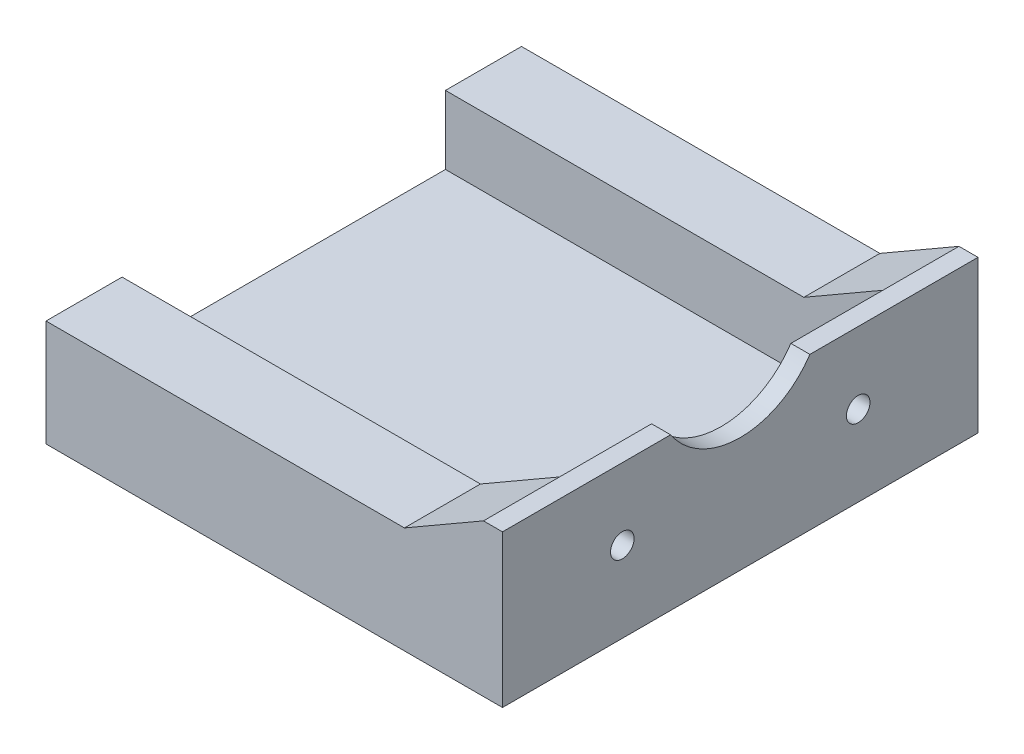
ISO-10303-21;
HEADER;
FILE_DESCRIPTION(('STEP AP214'),'2;1');
FILE_NAME('part.step','',(''),(''),'','','');
FILE_SCHEMA(('AUTOMOTIVE_DESIGN { 1 0 10303 214 1 1 1 1 }'));
ENDSEC;
DATA;
#1=APPLICATION_CONTEXT('core data for automotive mechanical design processes');
#2=APPLICATION_PROTOCOL_DEFINITION('international standard','automotive_design',2000,#1);
#3=PRODUCT_CONTEXT('',#1,'mechanical');
#4=PRODUCT('Part','Part','',(#3));
#5=PRODUCT_RELATED_PRODUCT_CATEGORY('part','',(#4));
#6=PRODUCT_DEFINITION_FORMATION('','',#4);
#7=PRODUCT_DEFINITION_CONTEXT('part definition',#1,'design');
#8=PRODUCT_DEFINITION('design','',#6,#7);
#9=PRODUCT_DEFINITION_SHAPE('','',#8);
#10=(LENGTH_UNIT() NAMED_UNIT(*) SI_UNIT(.MILLI.,.METRE.));
#11=(NAMED_UNIT(*) PLANE_ANGLE_UNIT() SI_UNIT($,.RADIAN.));
#12=(NAMED_UNIT(*) SI_UNIT($,.STERADIAN.) SOLID_ANGLE_UNIT());
#13=UNCERTAINTY_MEASURE_WITH_UNIT(LENGTH_MEASURE(1.E-05),#10,'distance_accuracy_value','');
#14=(GEOMETRIC_REPRESENTATION_CONTEXT(3) GLOBAL_UNCERTAINTY_ASSIGNED_CONTEXT((#13)) GLOBAL_UNIT_ASSIGNED_CONTEXT((#10,
#11,#12)) REPRESENTATION_CONTEXT('',''));
#15=CARTESIAN_POINT('',(0.,0.,0.));
#16=DIRECTION('',(0.,0.,1.));
#17=DIRECTION('',(1.,0.,0.));
#18=AXIS2_PLACEMENT_3D('',#15,#16,#17);
#19=CARTESIAN_POINT('',(10.,0.,-57.5));
#20=DIRECTION('',(0.,-1.,0.));
#21=DIRECTION('',(0.,0.,-1.));
#22=AXIS2_PLACEMENT_3D('',#19,#20,#21);
#23=CYLINDRICAL_SURFACE('',#22,3.2);
#24=CARTESIAN_POINT('',(10.,0.,-57.5));
#25=DIRECTION('',(0.,-1.,0.));
#26=DIRECTION('',(0.,0.,-1.));
#27=AXIS2_PLACEMENT_3D('',#24,#25,#26);
#28=CIRCLE('',#27,3.2);
#29=CARTESIAN_POINT('',(10.,0.,-60.7));
#30=VERTEX_POINT('',#29);
#31=EDGE_CURVE('E565',#30,#30,#28,.T.);
#32=ORIENTED_EDGE('',*,*,#31,.T.);
#33=EDGE_LOOP('',(#32));
#34=FACE_BOUND('',#33,.T.);
#35=CARTESIAN_POINT('',(10.,11.5,-57.5));
#36=DIRECTION('',(0.,1.,0.));
#37=DIRECTION('',(0.,0.,1.));
#38=AXIS2_PLACEMENT_3D('',#35,#36,#37);
#39=CIRCLE('',#38,3.2);
#40=CARTESIAN_POINT('',(10.,11.5,-54.3));
#41=VERTEX_POINT('',#40);
#42=EDGE_CURVE('E11',#41,#41,#39,.F.);
#43=ORIENTED_EDGE('',*,*,#42,.F.);
#44=EDGE_LOOP('',(#43));
#45=FACE_BOUND('',#44,.T.);
#46=ADVANCED_FACE('F36',(#34,#45),#23,.F.);
#47=CARTESIAN_POINT('',(40.,0.,-57.5));
#48=DIRECTION('',(0.,-1.,0.));
#49=DIRECTION('',(0.,0.,-1.));
#50=AXIS2_PLACEMENT_3D('',#47,#48,#49);
#51=CYLINDRICAL_SURFACE('',#50,3.19999999999999);
#52=CARTESIAN_POINT('',(40.,0.,-57.5));
#53=DIRECTION('',(0.,-1.,0.));
#54=DIRECTION('',(0.,0.,-1.));
#55=AXIS2_PLACEMENT_3D('',#52,#53,#54);
#56=CIRCLE('',#55,3.19999999999999);
#57=CARTESIAN_POINT('',(40.,0.,-60.7));
#58=VERTEX_POINT('',#57);
#59=EDGE_CURVE('E563',#58,#58,#56,.T.);
#60=ORIENTED_EDGE('',*,*,#59,.T.);
#61=EDGE_LOOP('',(#60));
#62=FACE_BOUND('',#61,.T.);
#63=CARTESIAN_POINT('',(40.,11.5,-57.5));
#64=DIRECTION('',(0.,1.,0.));
#65=DIRECTION('',(0.,0.,1.));
#66=AXIS2_PLACEMENT_3D('',#63,#64,#65);
#67=CIRCLE('',#66,3.19999999999999);
#68=CARTESIAN_POINT('',(40.,11.5,-54.3));
#69=VERTEX_POINT('',#68);
#70=EDGE_CURVE('E45',#69,#69,#67,.F.);
#71=ORIENTED_EDGE('',*,*,#70,.F.);
#72=EDGE_LOOP('',(#71));
#73=FACE_BOUND('',#72,.T.);
#74=ADVANCED_FACE('F249',(#62,#73),#51,.F.);
#75=CARTESIAN_POINT('',(0.,5.,0.));
#76=DIRECTION('',(0.,-1.,0.));
#77=DIRECTION('',(0.,0.,-1.));
#78=AXIS2_PLACEMENT_3D('',#75,#76,#77);
#79=PLANE('',#78);
#80=DIRECTION('',(1.,0.,0.));
#81=VECTOR('',#80,1.);
#82=CARTESIAN_POINT('',(31.5192378864665,5.,-52.5));
#83=LINE('',#82,#81);
#84=CARTESIAN_POINT('',(0.,5.,-52.5));
#85=VERTEX_POINT('',#84);
#86=CARTESIAN_POINT('',(57.5,5.,-52.5));
#87=VERTEX_POINT('',#86);
#88=EDGE_CURVE('E160',#85,#87,#83,.T.);
#89=ORIENTED_EDGE('',*,*,#88,.F.);
#90=DIRECTION('',(0.,0.,1.));
#91=VECTOR('',#90,1.);
#92=CARTESIAN_POINT('',(0.,5.,0.));
#93=LINE('',#92,#91);
#94=CARTESIAN_POINT('',(0.,5.,-10.));
#95=VERTEX_POINT('',#94);
#96=EDGE_CURVE('E151',#85,#95,#93,.T.);
#97=ORIENTED_EDGE('',*,*,#96,.T.);
#98=DIRECTION('',(1.,0.,0.));
#99=VECTOR('',#98,1.);
#100=CARTESIAN_POINT('',(31.5192378864665,5.,-10.));
#101=LINE('',#100,#99);
#102=CARTESIAN_POINT('',(57.5,5.,-10.));
#103=VERTEX_POINT('',#102);
#104=EDGE_CURVE('E186',#95,#103,#101,.T.);
#105=ORIENTED_EDGE('',*,*,#104,.T.);
#106=DIRECTION('',(0.,0.,1.));
#107=VECTOR('',#106,1.);
#108=CARTESIAN_POINT('',(57.5,5.,0.));
#109=LINE('',#108,#107);
#110=EDGE_CURVE('E200',#87,#103,#109,.T.);
#111=ORIENTED_EDGE('',*,*,#110,.F.);
#112=EDGE_LOOP('',(#89,#97,#105,#111));
#113=FACE_BOUND('',#112,.T.);
#114=ADVANCED_FACE('F251',(#113),#79,.F.);
#115=CARTESIAN_POINT('',(57.5,20.,-52.5));
#116=DIRECTION('',(0.499999999999995,-0.866025403784442,0.));
#117=DIRECTION('',(0.866025403784442,0.499999999999995,0.));
#118=AXIS2_PLACEMENT_3D('',#115,#116,#117);
#119=PLANE('',#118);
#120=DIRECTION('',(0.,0.,-1.));
#121=VECTOR('',#120,1.);
#122=CARTESIAN_POINT('',(47.1076951545867,14.,-52.5));
#123=LINE('',#122,#121);
#124=CARTESIAN_POINT('',(47.1076951545866,14.,-52.5));
#125=VERTEX_POINT('',#124);
#126=CARTESIAN_POINT('',(47.1076951545867,14.0000000000001,-62.5));
#127=VERTEX_POINT('',#126);
#128=EDGE_CURVE('E146',#125,#127,#123,.T.);
#129=ORIENTED_EDGE('',*,*,#128,.F.);
#130=DIRECTION('',(-0.866025403784442,-0.499999999999995,0.));
#131=VECTOR('',#130,1.);
#132=CARTESIAN_POINT('',(57.5,20.,-52.5));
#133=LINE('',#132,#131);
#134=CARTESIAN_POINT('',(57.5,20.,-52.5));
#135=VERTEX_POINT('',#134);
#136=EDGE_CURVE('E136',#135,#125,#133,.T.);
#137=ORIENTED_EDGE('',*,*,#136,.F.);
#138=DIRECTION('',(0.,0.,-1.));
#139=VECTOR('',#138,1.);
#140=CARTESIAN_POINT('',(57.5,20.,-52.5));
#141=LINE('',#140,#139);
#142=CARTESIAN_POINT('',(57.5,20.,-62.5));
#143=VERTEX_POINT('',#142);
#144=EDGE_CURVE('E163',#135,#143,#141,.T.);
#145=ORIENTED_EDGE('',*,*,#144,.T.);
#146=DIRECTION('',(-0.866025403784442,-0.499999999999995,0.));
#147=VECTOR('',#146,1.);
#148=CARTESIAN_POINT('',(57.5,20.,-62.5));
#149=LINE('',#148,#147);
#150=EDGE_CURVE('E61',#143,#127,#149,.T.);
#151=ORIENTED_EDGE('',*,*,#150,.T.);
#152=EDGE_LOOP('',(#129,#137,#145,#151));
#153=FACE_BOUND('',#152,.T.);
#154=ADVANCED_FACE('F258',(#153),#119,.F.);
#155=CARTESIAN_POINT('',(57.5,20.,-10.));
#156=DIRECTION('',(-0.499999999999995,0.866025403784442,0.));
#157=DIRECTION('',(-0.866025403784442,-0.499999999999995,0.));
#158=AXIS2_PLACEMENT_3D('',#155,#156,#157);
#159=PLANE('',#158);
#160=DIRECTION('',(-0.866025403784442,-0.499999999999995,0.));
#161=VECTOR('',#160,1.);
#162=CARTESIAN_POINT('',(57.5,20.,-10.));
#163=LINE('',#162,#161);
#164=CARTESIAN_POINT('',(57.5,20.,-10.));
#165=VERTEX_POINT('',#164);
#166=CARTESIAN_POINT('',(47.1076951545867,14.,-10.));
#167=VERTEX_POINT('',#166);
#168=EDGE_CURVE('E183',#165,#167,#163,.T.);
#169=ORIENTED_EDGE('',*,*,#168,.T.);
#170=DIRECTION('',(0.,0.,1.));
#171=VECTOR('',#170,1.);
#172=CARTESIAN_POINT('',(47.1076951545867,14.,-10.));
#173=LINE('',#172,#171);
#174=CARTESIAN_POINT('',(47.1076951545867,14.,0.));
#175=VERTEX_POINT('',#174);
#176=EDGE_CURVE('E172',#167,#175,#173,.T.);
#177=ORIENTED_EDGE('',*,*,#176,.T.);
#178=DIRECTION('',(-0.866025403784442,-0.499999999999995,0.));
#179=VECTOR('',#178,1.);
#180=CARTESIAN_POINT('',(57.5,20.,0.));
#181=LINE('',#180,#179);
#182=CARTESIAN_POINT('',(57.5,20.,0.));
#183=VERTEX_POINT('',#182);
#184=EDGE_CURVE('E180',#183,#175,#181,.T.);
#185=ORIENTED_EDGE('',*,*,#184,.F.);
#186=DIRECTION('',(0.,0.,-1.));
#187=VECTOR('',#186,1.);
#188=CARTESIAN_POINT('',(57.5,20.,0.));
#189=LINE('',#188,#187);
#190=EDGE_CURVE('E197',#183,#165,#189,.T.);
#191=ORIENTED_EDGE('',*,*,#190,.T.);
#192=EDGE_LOOP('',(#169,#177,#185,#191));
#193=FACE_BOUND('',#192,.T.);
#194=ADVANCED_FACE('F291',(#193),#159,.T.);
#195=CARTESIAN_POINT('',(0.,5.,0.));
#196=DIRECTION('',(1.,0.,0.));
#197=DIRECTION('',(0.,0.,-1.));
#198=AXIS2_PLACEMENT_3D('',#195,#196,#197);
#199=PLANE('',#198);
#200=DIRECTION('',(0.,0.,1.));
#201=VECTOR('',#200,1.);
#202=CARTESIAN_POINT('',(0.,0.,0.));
#203=LINE('',#202,#201);
#204=CARTESIAN_POINT('',(0.,0.,-62.5));
#205=VERTEX_POINT('',#204);
#206=CARTESIAN_POINT('',(0.,0.,0.));
#207=VERTEX_POINT('',#206);
#208=EDGE_CURVE('E210',#205,#207,#203,.T.);
#209=ORIENTED_EDGE('',*,*,#208,.T.);
#210=DIRECTION('',(0.,-1.,0.));
#211=VECTOR('',#210,1.);
#212=CARTESIAN_POINT('',(0.,5.,0.));
#213=LINE('',#212,#211);
#214=CARTESIAN_POINT('',(0.,14.,0.));
#215=VERTEX_POINT('',#214);
#216=EDGE_CURVE('E237',#215,#207,#213,.T.);
#217=ORIENTED_EDGE('',*,*,#216,.F.);
#218=DIRECTION('',(0.,0.,1.));
#219=VECTOR('',#218,1.);
#220=CARTESIAN_POINT('',(0.,14.,-10.));
#221=LINE('',#220,#219);
#222=CARTESIAN_POINT('',(0.,14.,-10.));
#223=VERTEX_POINT('',#222);
#224=EDGE_CURVE('E177',#223,#215,#221,.T.);
#225=ORIENTED_EDGE('',*,*,#224,.F.);
#226=DIRECTION('',(0.,-1.,0.));
#227=VECTOR('',#226,1.);
#228=CARTESIAN_POINT('',(0.,14.,-10.));
#229=LINE('',#228,#227);
#230=EDGE_CURVE('E167',#223,#95,#229,.T.);
#231=ORIENTED_EDGE('',*,*,#230,.T.);
#232=ORIENTED_EDGE('',*,*,#96,.F.);
#233=DIRECTION('',(0.,-1.,0.));
#234=VECTOR('',#233,1.);
#235=CARTESIAN_POINT('',(0.,14.,-52.5));
#236=LINE('',#235,#234);
#237=CARTESIAN_POINT('',(0.,14.,-52.5));
#238=VERTEX_POINT('',#237);
#239=EDGE_CURVE('E53',#238,#85,#236,.T.);
#240=ORIENTED_EDGE('',*,*,#239,.F.);
#241=DIRECTION('',(0.,0.,-1.));
#242=VECTOR('',#241,1.);
#243=CARTESIAN_POINT('',(0.,14.,-52.5));
#244=LINE('',#243,#242);
#245=CARTESIAN_POINT('',(0.,14.,-62.5));
#246=VERTEX_POINT('',#245);
#247=EDGE_CURVE('E142',#238,#246,#244,.T.);
#248=ORIENTED_EDGE('',*,*,#247,.T.);
#249=DIRECTION('',(0.,-1.,0.));
#250=VECTOR('',#249,1.);
#251=CARTESIAN_POINT('',(0.,5.,-62.5));
#252=LINE('',#251,#250);
#253=EDGE_CURVE('E221',#246,#205,#252,.T.);
#254=ORIENTED_EDGE('',*,*,#253,.T.);
#255=EDGE_LOOP('',(#209,#217,#225,#231,#232,#240,#248,#254));
#256=FACE_BOUND('',#255,.T.);
#257=ADVANCED_FACE('F38',(#256),#199,.F.);
#258=CARTESIAN_POINT('',(0.,5.,0.));
#259=DIRECTION('',(0.,0.,-1.));
#260=DIRECTION('',(-1.,0.,0.));
#261=AXIS2_PLACEMENT_3D('',#258,#259,#260);
#262=PLANE('',#261);
#263=ORIENTED_EDGE('',*,*,#184,.T.);
#264=DIRECTION('',(-1.,0.,0.));
#265=VECTOR('',#264,1.);
#266=CARTESIAN_POINT('',(47.1076951545867,14.,0.));
#267=LINE('',#266,#265);
#268=EDGE_CURVE('E166',#175,#215,#267,.T.);
#269=ORIENTED_EDGE('',*,*,#268,.T.);
#270=ORIENTED_EDGE('',*,*,#216,.T.);
#271=DIRECTION('',(1.,0.,0.));
#272=VECTOR('',#271,1.);
#273=CARTESIAN_POINT('',(0.,0.,0.));
#274=LINE('',#273,#272);
#275=CARTESIAN_POINT('',(60.,0.,0.));
#276=VERTEX_POINT('',#275);
#277=EDGE_CURVE('E224',#207,#276,#274,.T.);
#278=ORIENTED_EDGE('',*,*,#277,.T.);
#279=DIRECTION('',(0.,-1.,0.));
#280=VECTOR('',#279,1.);
#281=CARTESIAN_POINT('',(60.,5.,0.));
#282=LINE('',#281,#280);
#283=CARTESIAN_POINT('',(60.,20.,0.));
#284=VERTEX_POINT('',#283);
#285=EDGE_CURVE('E234',#284,#276,#282,.T.);
#286=ORIENTED_EDGE('',*,*,#285,.F.);
#287=DIRECTION('',(1.,0.,0.));
#288=VECTOR('',#287,1.);
#289=CARTESIAN_POINT('',(57.5,20.,0.));
#290=LINE('',#289,#288);
#291=EDGE_CURVE('E214',#183,#284,#290,.T.);
#292=ORIENTED_EDGE('',*,*,#291,.F.);
#293=EDGE_LOOP('',(#263,#269,#270,#278,#286,#292));
#294=FACE_BOUND('',#293,.T.);
#295=ADVANCED_FACE('F325',(#294),#262,.F.);
#296=CARTESIAN_POINT('',(60.,5.,0.));
#297=DIRECTION('',(-1.,0.,0.));
#298=DIRECTION('',(0.,0.,1.));
#299=AXIS2_PLACEMENT_3D('',#296,#297,#298);
#300=PLANE('',#299);
#301=CARTESIAN_POINT('',(60.,10.6000000000001,-15.7499999999999));
#302=DIRECTION('',(1.,0.,0.));
#303=DIRECTION('',(0.,0.,-1.));
#304=AXIS2_PLACEMENT_3D('',#301,#302,#303);
#305=CIRCLE('',#304,1.55);
#306=CARTESIAN_POINT('',(60.,10.6000000000001,-17.2999999999999));
#307=VERTEX_POINT('',#306);
#308=EDGE_CURVE('E242',#307,#307,#305,.T.);
#309=ORIENTED_EDGE('',*,*,#308,.F.);
#310=EDGE_LOOP('',(#309));
#311=FACE_BOUND('',#310,.T.);
#312=CARTESIAN_POINT('',(60.,10.5999999999999,-46.75));
#313=DIRECTION('',(1.,0.,0.));
#314=DIRECTION('',(0.,0.,-1.));
#315=AXIS2_PLACEMENT_3D('',#312,#313,#314);
#316=CIRCLE('',#315,1.55);
#317=CARTESIAN_POINT('',(60.,10.5999999999999,-48.3));
#318=VERTEX_POINT('',#317);
#319=EDGE_CURVE('E577',#318,#318,#316,.T.);
#320=ORIENTED_EDGE('',*,*,#319,.F.);
#321=EDGE_LOOP('',(#320));
#322=FACE_BOUND('',#321,.T.);
#323=DIRECTION('',(0.,0.,-1.));
#324=VECTOR('',#323,1.);
#325=CARTESIAN_POINT('',(60.,0.,0.));
#326=LINE('',#325,#324);
#327=CARTESIAN_POINT('',(60.,0.,-62.5));
#328=VERTEX_POINT('',#327);
#329=EDGE_CURVE('E226',#276,#328,#326,.T.);
#330=ORIENTED_EDGE('',*,*,#329,.T.);
#331=DIRECTION('',(0.,-1.,0.));
#332=VECTOR('',#331,1.);
#333=CARTESIAN_POINT('',(60.,5.,-62.5));
#334=LINE('',#333,#332);
#335=CARTESIAN_POINT('',(60.,20.,-62.5));
#336=VERTEX_POINT('',#335);
#337=EDGE_CURVE('E231',#336,#328,#334,.T.);
#338=ORIENTED_EDGE('',*,*,#337,.F.);
#339=DIRECTION('',(0.,0.,-1.));
#340=VECTOR('',#339,1.);
#341=CARTESIAN_POINT('',(60.,20.,0.));
#342=LINE('',#341,#340);
#343=CARTESIAN_POINT('',(60.,20.,-40.4036877814354));
#344=VERTEX_POINT('',#343);
#345=EDGE_CURVE('E196',#344,#336,#342,.T.);
#346=ORIENTED_EDGE('',*,*,#345,.F.);
#347=CARTESIAN_POINT('',(60.,26.1,-31.25));
#348=DIRECTION('',(1.,0.,0.));
#349=DIRECTION('',(0.,0.,-1.));
#350=AXIS2_PLACEMENT_3D('',#347,#348,#349);
#351=CIRCLE('',#350,11.);
#352=CARTESIAN_POINT('',(60.,20.,-22.0963122185646));
#353=VERTEX_POINT('',#352);
#354=EDGE_CURVE('E189',#353,#344,#351,.T.);
#355=ORIENTED_EDGE('',*,*,#354,.F.);
#356=EDGE_CURVE('E205',#284,#353,#342,.T.);
#357=ORIENTED_EDGE('',*,*,#356,.F.);
#358=ORIENTED_EDGE('',*,*,#285,.T.);
#359=EDGE_LOOP('',(#330,#338,#346,#355,#357,#358));
#360=FACE_BOUND('',#359,.T.);
#361=ADVANCED_FACE('F322',(#311,#322,#360),#300,.F.);
#362=CARTESIAN_POINT('',(0.,5.,-62.5));
#363=DIRECTION('',(0.,0.,1.));
#364=DIRECTION('',(1.,0.,0.));
#365=AXIS2_PLACEMENT_3D('',#362,#363,#364);
#366=PLANE('',#365);
#367=DIRECTION('',(-1.,0.,0.));
#368=VECTOR('',#367,1.);
#369=CARTESIAN_POINT('',(47.1076951545867,14.,-62.5));
#370=LINE('',#369,#368);
#371=EDGE_CURVE('E138',#127,#246,#370,.T.);
#372=ORIENTED_EDGE('',*,*,#371,.F.);
#373=ORIENTED_EDGE('',*,*,#150,.F.);
#374=DIRECTION('',(1.,0.,0.));
#375=VECTOR('',#374,1.);
#376=CARTESIAN_POINT('',(57.5,20.,-62.5));
#377=LINE('',#376,#375);
#378=EDGE_CURVE('E211',#143,#336,#377,.T.);
#379=ORIENTED_EDGE('',*,*,#378,.T.);
#380=ORIENTED_EDGE('',*,*,#337,.T.);
#381=DIRECTION('',(-1.,0.,0.));
#382=VECTOR('',#381,1.);
#383=CARTESIAN_POINT('',(0.,0.,-62.5));
#384=LINE('',#383,#382);
#385=EDGE_CURVE('E222',#328,#205,#384,.T.);
#386=ORIENTED_EDGE('',*,*,#385,.T.);
#387=ORIENTED_EDGE('',*,*,#253,.F.);
#388=EDGE_LOOP('',(#372,#373,#379,#380,#386,#387));
#389=FACE_BOUND('',#388,.T.);
#390=ADVANCED_FACE('F318',(#389),#366,.F.);
#391=CARTESIAN_POINT('',(0.,0.,0.));
#392=DIRECTION('',(0.,-1.,0.));
#393=DIRECTION('',(0.,0.,-1.));
#394=AXIS2_PLACEMENT_3D('',#391,#392,#393);
#395=PLANE('',#394);
#396=ORIENTED_EDGE('',*,*,#59,.F.);
#397=EDGE_LOOP('',(#396));
#398=FACE_BOUND('',#397,.T.);
#399=ORIENTED_EDGE('',*,*,#31,.F.);
#400=EDGE_LOOP('',(#399));
#401=FACE_BOUND('',#400,.T.);
#402=CARTESIAN_POINT('',(40.,0.,-5.));
#403=DIRECTION('',(0.,-1.,0.));
#404=DIRECTION('',(0.,0.,-1.));
#405=AXIS2_PLACEMENT_3D('',#402,#403,#404);
#406=CIRCLE('',#405,3.19999999999999);
#407=CARTESIAN_POINT('',(40.,0.,-8.2));
#408=VERTEX_POINT('',#407);
#409=EDGE_CURVE('E571',#408,#408,#406,.T.);
#410=ORIENTED_EDGE('',*,*,#409,.F.);
#411=EDGE_LOOP('',(#410));
#412=FACE_BOUND('',#411,.T.);
#413=CARTESIAN_POINT('',(10.,0.,-5.));
#414=DIRECTION('',(0.,-1.,0.));
#415=DIRECTION('',(0.,0.,-1.));
#416=AXIS2_PLACEMENT_3D('',#413,#414,#415);
#417=CIRCLE('',#416,3.2);
#418=CARTESIAN_POINT('',(10.,0.,-8.2));
#419=VERTEX_POINT('',#418);
#420=EDGE_CURVE('E574',#419,#419,#417,.T.);
#421=ORIENTED_EDGE('',*,*,#420,.F.);
#422=EDGE_LOOP('',(#421));
#423=FACE_BOUND('',#422,.T.);
#424=ORIENTED_EDGE('',*,*,#208,.F.);
#425=ORIENTED_EDGE('',*,*,#385,.F.);
#426=ORIENTED_EDGE('',*,*,#329,.F.);
#427=ORIENTED_EDGE('',*,*,#277,.F.);
#428=EDGE_LOOP('',(#424,#425,#426,#427));
#429=FACE_BOUND('',#428,.T.);
#430=ADVANCED_FACE('F313',(#398,#401,#412,#423,#429),#395,.T.);
#431=CARTESIAN_POINT('',(57.5,26.1,-31.25));
#432=DIRECTION('',(1.,0.,0.));
#433=DIRECTION('',(0.,0.,-1.));
#434=AXIS2_PLACEMENT_3D('',#431,#432,#433);
#435=CYLINDRICAL_SURFACE('',#434,11.);
#436=ORIENTED_EDGE('',*,*,#354,.T.);
#437=DIRECTION('',(1.,0.,0.));
#438=VECTOR('',#437,1.);
#439=CARTESIAN_POINT('',(57.5,20.,-40.4036877814354));
#440=LINE('',#439,#438);
#441=CARTESIAN_POINT('',(57.5,20.,-40.4036877814354));
#442=VERTEX_POINT('',#441);
#443=EDGE_CURVE('E207',#442,#344,#440,.T.);
#444=ORIENTED_EDGE('',*,*,#443,.F.);
#445=CARTESIAN_POINT('',(57.5,26.1,-31.25));
#446=DIRECTION('',(1.,0.,0.));
#447=DIRECTION('',(0.,0.,-1.));
#448=AXIS2_PLACEMENT_3D('',#445,#446,#447);
#449=CIRCLE('',#448,11.);
#450=CARTESIAN_POINT('',(57.5,20.,-22.0963122185646));
#451=VERTEX_POINT('',#450);
#452=EDGE_CURVE('E192',#451,#442,#449,.T.);
#453=ORIENTED_EDGE('',*,*,#452,.F.);
#454=DIRECTION('',(1.,0.,0.));
#455=VECTOR('',#454,1.);
#456=CARTESIAN_POINT('',(57.5,20.,-22.0963122185646));
#457=LINE('',#456,#455);
#458=EDGE_CURVE('E217',#451,#353,#457,.T.);
#459=ORIENTED_EDGE('',*,*,#458,.T.);
#460=EDGE_LOOP('',(#436,#444,#453,#459));
#461=FACE_BOUND('',#460,.T.);
#462=ADVANCED_FACE('F310',(#461),#435,.F.);
#463=CARTESIAN_POINT('',(57.5,20.,0.));
#464=DIRECTION('',(0.,-1.,0.));
#465=DIRECTION('',(0.,0.,-1.));
#466=AXIS2_PLACEMENT_3D('',#463,#464,#465);
#467=PLANE('',#466);
#468=ORIENTED_EDGE('',*,*,#345,.T.);
#469=ORIENTED_EDGE('',*,*,#378,.F.);
#470=ORIENTED_EDGE('',*,*,#144,.F.);
#471=EDGE_CURVE('E201',#442,#135,#189,.T.);
#472=ORIENTED_EDGE('',*,*,#471,.F.);
#473=ORIENTED_EDGE('',*,*,#443,.T.);
#474=EDGE_LOOP('',(#468,#469,#470,#472,#473));
#475=FACE_BOUND('',#474,.T.);
#476=ADVANCED_FACE('F307',(#475),#467,.F.);
#477=ORIENTED_EDGE('',*,*,#356,.T.);
#478=ORIENTED_EDGE('',*,*,#458,.F.);
#479=EDGE_CURVE('E195',#165,#451,#189,.T.);
#480=ORIENTED_EDGE('',*,*,#479,.F.);
#481=ORIENTED_EDGE('',*,*,#190,.F.);
#482=ORIENTED_EDGE('',*,*,#291,.T.);
#483=EDGE_LOOP('',(#477,#478,#480,#481,#482));
#484=FACE_BOUND('',#483,.T.);
#485=ADVANCED_FACE('F305',(#484),#467,.F.);
#486=CARTESIAN_POINT('',(57.5,0.,0.));
#487=DIRECTION('',(1.,0.,0.));
#488=DIRECTION('',(0.,0.,-1.));
#489=AXIS2_PLACEMENT_3D('',#486,#487,#488);
#490=PLANE('',#489);
#491=CARTESIAN_POINT('',(57.5,10.6000000000001,-15.7499999999999));
#492=DIRECTION('',(1.,0.,0.));
#493=DIRECTION('',(0.,0.,-1.));
#494=AXIS2_PLACEMENT_3D('',#491,#492,#493);
#495=CIRCLE('',#494,1.55);
#496=CARTESIAN_POINT('',(57.5,10.6000000000001,-17.2999999999999));
#497=VERTEX_POINT('',#496);
#498=EDGE_CURVE('E155',#497,#497,#495,.T.);
#499=ORIENTED_EDGE('',*,*,#498,.T.);
#500=EDGE_LOOP('',(#499));
#501=FACE_BOUND('',#500,.T.);
#502=CARTESIAN_POINT('',(57.5,10.5999999999999,-46.75));
#503=DIRECTION('',(1.,0.,0.));
#504=DIRECTION('',(0.,0.,-1.));
#505=AXIS2_PLACEMENT_3D('',#502,#503,#504);
#506=CIRCLE('',#505,1.55);
#507=CARTESIAN_POINT('',(57.5,10.5999999999999,-48.3));
#508=VERTEX_POINT('',#507);
#509=EDGE_CURVE('E239',#508,#508,#506,.T.);
#510=ORIENTED_EDGE('',*,*,#509,.T.);
#511=EDGE_LOOP('',(#510));
#512=FACE_BOUND('',#511,.T.);
#513=ORIENTED_EDGE('',*,*,#471,.T.);
#514=DIRECTION('',(0.,1.,0.));
#515=VECTOR('',#514,1.);
#516=CARTESIAN_POINT('',(57.5,5.,-52.5));
#517=LINE('',#516,#515);
#518=EDGE_CURVE('E158',#87,#135,#517,.T.);
#519=ORIENTED_EDGE('',*,*,#518,.F.);
#520=ORIENTED_EDGE('',*,*,#110,.T.);
#521=DIRECTION('',(0.,1.,0.));
#522=VECTOR('',#521,1.);
#523=CARTESIAN_POINT('',(57.5,5.,-10.));
#524=LINE('',#523,#522);
#525=EDGE_CURVE('E181',#103,#165,#524,.T.);
#526=ORIENTED_EDGE('',*,*,#525,.T.);
#527=ORIENTED_EDGE('',*,*,#479,.T.);
#528=ORIENTED_EDGE('',*,*,#452,.T.);
#529=EDGE_LOOP('',(#513,#519,#520,#526,#527,#528));
#530=FACE_BOUND('',#529,.T.);
#531=ADVANCED_FACE('F298',(#501,#512,#530),#490,.F.);
#532=CARTESIAN_POINT('',(0.,0.,-10.));
#533=DIRECTION('',(0.,0.,-1.));
#534=DIRECTION('',(-1.,0.,0.));
#535=AXIS2_PLACEMENT_3D('',#532,#533,#534);
#536=PLANE('',#535);
#537=DIRECTION('',(-1.,0.,0.));
#538=VECTOR('',#537,1.);
#539=CARTESIAN_POINT('',(47.1076951545867,14.,-10.));
#540=LINE('',#539,#538);
#541=EDGE_CURVE('E169',#167,#223,#540,.T.);
#542=ORIENTED_EDGE('',*,*,#541,.F.);
#543=ORIENTED_EDGE('',*,*,#168,.F.);
#544=ORIENTED_EDGE('',*,*,#525,.F.);
#545=ORIENTED_EDGE('',*,*,#104,.F.);
#546=ORIENTED_EDGE('',*,*,#230,.F.);
#547=EDGE_LOOP('',(#542,#543,#544,#545,#546));
#548=FACE_BOUND('',#547,.T.);
#549=ADVANCED_FACE('F294',(#548),#536,.T.);
#550=CARTESIAN_POINT('',(47.1076951545867,14.,-10.));
#551=DIRECTION('',(0.,1.,0.));
#552=DIRECTION('',(0.,0.,1.));
#553=AXIS2_PLACEMENT_3D('',#550,#551,#552);
#554=PLANE('',#553);
#555=ORIENTED_EDGE('',*,*,#268,.F.);
#556=ORIENTED_EDGE('',*,*,#176,.F.);
#557=ORIENTED_EDGE('',*,*,#541,.T.);
#558=ORIENTED_EDGE('',*,*,#224,.T.);
#559=EDGE_LOOP('',(#555,#556,#557,#558));
#560=FACE_BOUND('',#559,.T.);
#561=ADVANCED_FACE('F288',(#560),#554,.T.);
#562=CARTESIAN_POINT('',(0.,0.,-52.5));
#563=DIRECTION('',(0.,0.,1.));
#564=DIRECTION('',(-1.,0.,0.));
#565=AXIS2_PLACEMENT_3D('',#562,#563,#564);
#566=PLANE('',#565);
#567=ORIENTED_EDGE('',*,*,#136,.T.);
#568=DIRECTION('',(-1.,0.,0.));
#569=VECTOR('',#568,1.);
#570=CARTESIAN_POINT('',(47.1076951545867,14.,-52.5));
#571=LINE('',#570,#569);
#572=EDGE_CURVE('E132',#125,#238,#571,.T.);
#573=ORIENTED_EDGE('',*,*,#572,.T.);
#574=ORIENTED_EDGE('',*,*,#239,.T.);
#575=ORIENTED_EDGE('',*,*,#88,.T.);
#576=ORIENTED_EDGE('',*,*,#518,.T.);
#577=EDGE_LOOP('',(#567,#573,#574,#575,#576));
#578=FACE_BOUND('',#577,.T.);
#579=ADVANCED_FACE('F134',(#578),#566,.T.);
#580=CARTESIAN_POINT('',(47.1076951545867,14.,-52.5));
#581=DIRECTION('',(0.,-1.,0.));
#582=DIRECTION('',(0.,0.,-1.));
#583=AXIS2_PLACEMENT_3D('',#580,#581,#582);
#584=PLANE('',#583);
#585=ORIENTED_EDGE('',*,*,#371,.T.);
#586=ORIENTED_EDGE('',*,*,#247,.F.);
#587=ORIENTED_EDGE('',*,*,#572,.F.);
#588=ORIENTED_EDGE('',*,*,#128,.T.);
#589=EDGE_LOOP('',(#585,#586,#587,#588));
#590=FACE_BOUND('',#589,.T.);
#591=ADVANCED_FACE('F143',(#590),#584,.F.);
#592=CARTESIAN_POINT('',(50.,10.5999999999999,-46.75));
#593=DIRECTION('',(1.,0.,0.));
#594=DIRECTION('',(0.,0.,-1.));
#595=AXIS2_PLACEMENT_3D('',#592,#593,#594);
#596=CYLINDRICAL_SURFACE('',#595,1.55);
#597=ORIENTED_EDGE('',*,*,#319,.T.);
#598=EDGE_LOOP('',(#597));
#599=FACE_BOUND('',#598,.T.);
#600=ORIENTED_EDGE('',*,*,#509,.F.);
#601=EDGE_LOOP('',(#600));
#602=FACE_BOUND('',#601,.T.);
#603=ADVANCED_FACE('F279',(#599,#602),#596,.F.);
#604=CARTESIAN_POINT('',(50.,10.6000000000001,-15.7499999999999));
#605=DIRECTION('',(1.,0.,0.));
#606=DIRECTION('',(0.,0.,-1.));
#607=AXIS2_PLACEMENT_3D('',#604,#605,#606);
#608=CYLINDRICAL_SURFACE('',#607,1.55);
#609=ORIENTED_EDGE('',*,*,#308,.T.);
#610=EDGE_LOOP('',(#609));
#611=FACE_BOUND('',#610,.T.);
#612=ORIENTED_EDGE('',*,*,#498,.F.);
#613=EDGE_LOOP('',(#612));
#614=FACE_BOUND('',#613,.T.);
#615=ADVANCED_FACE('F275',(#611,#614),#608,.F.);
#616=CARTESIAN_POINT('',(10.,0.,-5.));
#617=DIRECTION('',(0.,-1.,0.));
#618=DIRECTION('',(0.,0.,-1.));
#619=AXIS2_PLACEMENT_3D('',#616,#617,#618);
#620=CYLINDRICAL_SURFACE('',#619,3.2);
#621=CARTESIAN_POINT('',(10.,11.5,-5.));
#622=DIRECTION('',(0.,-1.,0.));
#623=DIRECTION('',(0.,0.,-1.));
#624=AXIS2_PLACEMENT_3D('',#621,#622,#623);
#625=CIRCLE('',#624,3.2);
#626=CARTESIAN_POINT('',(10.,11.5,-8.2));
#627=VERTEX_POINT('',#626);
#628=EDGE_CURVE('E562',#627,#627,#625,.F.);
#629=ORIENTED_EDGE('',*,*,#628,.T.);
#630=EDGE_LOOP('',(#629));
#631=FACE_BOUND('',#630,.T.);
#632=ORIENTED_EDGE('',*,*,#420,.T.);
#633=EDGE_LOOP('',(#632));
#634=FACE_BOUND('',#633,.T.);
#635=ADVANCED_FACE('F271',(#631,#634),#620,.F.);
#636=CARTESIAN_POINT('',(40.,0.,-5.));
#637=DIRECTION('',(0.,-1.,0.));
#638=DIRECTION('',(0.,0.,-1.));
#639=AXIS2_PLACEMENT_3D('',#636,#637,#638);
#640=CYLINDRICAL_SURFACE('',#639,3.19999999999999);
#641=CARTESIAN_POINT('',(40.,11.5,-5.));
#642=DIRECTION('',(0.,-1.,0.));
#643=DIRECTION('',(0.,0.,-1.));
#644=AXIS2_PLACEMENT_3D('',#641,#642,#643);
#645=CIRCLE('',#644,3.19999999999999);
#646=CARTESIAN_POINT('',(40.,11.5,-8.2));
#647=VERTEX_POINT('',#646);
#648=EDGE_CURVE('E40',#647,#647,#645,.F.);
#649=ORIENTED_EDGE('',*,*,#648,.T.);
#650=EDGE_LOOP('',(#649));
#651=FACE_BOUND('',#650,.T.);
#652=ORIENTED_EDGE('',*,*,#409,.T.);
#653=EDGE_LOOP('',(#652));
#654=FACE_BOUND('',#653,.T.);
#655=ADVANCED_FACE('F268',(#651,#654),#640,.F.);
#656=CARTESIAN_POINT('',(0.,11.5,0.));
#657=DIRECTION('',(0.,1.,0.));
#658=DIRECTION('',(0.,0.,1.));
#659=AXIS2_PLACEMENT_3D('',#656,#657,#658);
#660=PLANE('',#659);
#661=ORIENTED_EDGE('',*,*,#70,.T.);
#662=EDGE_LOOP('',(#661));
#663=FACE_BOUND('',#662,.T.);
#664=ADVANCED_FACE('F247',(#663),#660,.F.);
#665=ORIENTED_EDGE('',*,*,#42,.T.);
#666=EDGE_LOOP('',(#665));
#667=FACE_BOUND('',#666,.T.);
#668=ADVANCED_FACE('F265',(#667),#660,.F.);
#669=CARTESIAN_POINT('',(0.,11.5,0.));
#670=DIRECTION('',(0.,-1.,0.));
#671=DIRECTION('',(0.,0.,-1.));
#672=AXIS2_PLACEMENT_3D('',#669,#670,#671);
#673=PLANE('',#672);
#674=ORIENTED_EDGE('',*,*,#648,.F.);
#675=EDGE_LOOP('',(#674));
#676=FACE_BOUND('',#675,.T.);
#677=ADVANCED_FACE('F416',(#676),#673,.T.);
#678=ORIENTED_EDGE('',*,*,#628,.F.);
#679=EDGE_LOOP('',(#678));
#680=FACE_BOUND('',#679,.T.);
#681=ADVANCED_FACE('F423',(#680),#673,.T.);
#682=CLOSED_SHELL('',(#46,#74,#114,#154,#194,#257,#295,#361,#390,#430,#462,#476,#485,#531,#549,
#561,#579,#591,#603,#615,#635,#655,#664,#668,#677,#681));
#683=MANIFOLD_SOLID_BREP('B2',#682);
#684=ADVANCED_BREP_SHAPE_REPRESENTATION('',(#18,#683),#14);
#685=SHAPE_DEFINITION_REPRESENTATION(#9,#684);
ENDSEC;
END-ISO-10303-21;
